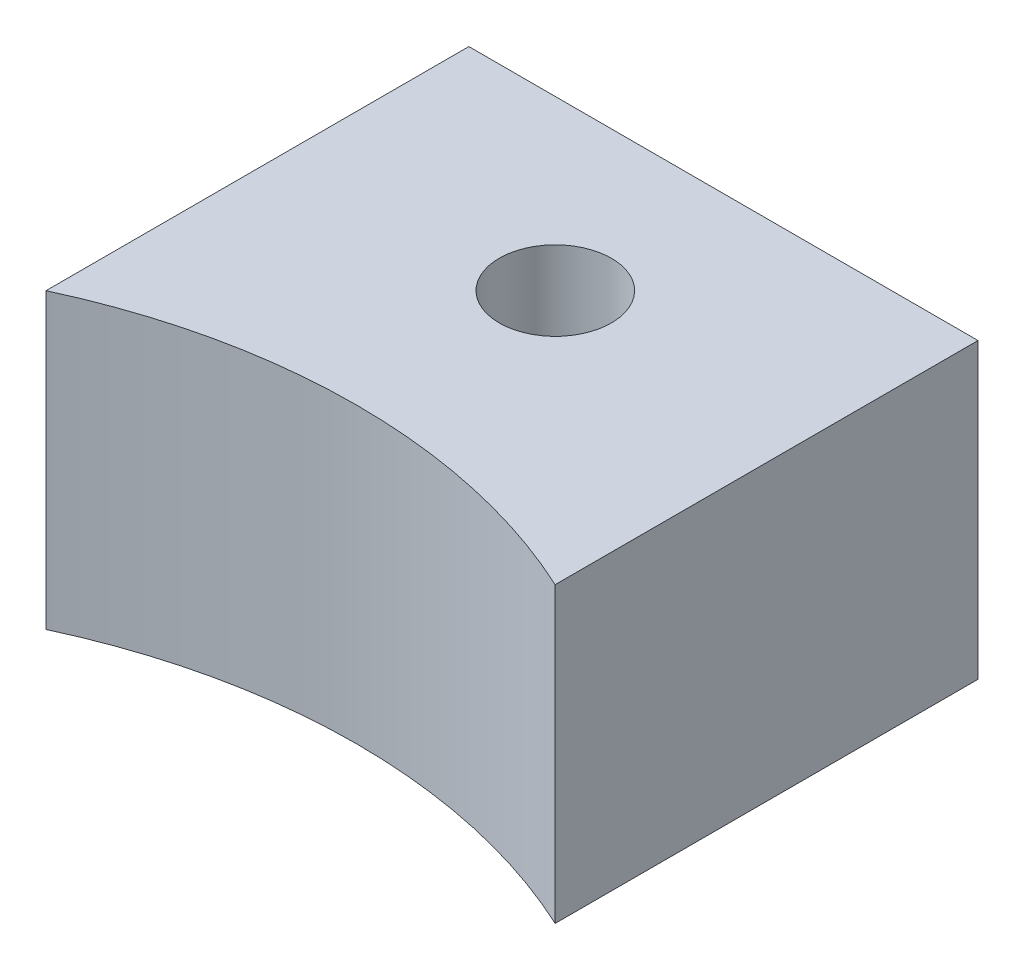
ISO-10303-21;
HEADER;
FILE_DESCRIPTION(('STEP AP214'),'2;1');
FILE_NAME('part.step','',(''),(''),'','','');
FILE_SCHEMA(('AUTOMOTIVE_DESIGN { 1 0 10303 214 1 1 1 1 }'));
ENDSEC;
DATA;
#1=APPLICATION_CONTEXT('core data for automotive mechanical design processes');
#2=APPLICATION_PROTOCOL_DEFINITION('international standard','automotive_design',2000,#1);
#3=PRODUCT_CONTEXT('',#1,'mechanical');
#4=PRODUCT('Part','Part','',(#3));
#5=PRODUCT_RELATED_PRODUCT_CATEGORY('part','',(#4));
#6=PRODUCT_DEFINITION_FORMATION('','',#4);
#7=PRODUCT_DEFINITION_CONTEXT('part definition',#1,'design');
#8=PRODUCT_DEFINITION('design','',#6,#7);
#9=PRODUCT_DEFINITION_SHAPE('','',#8);
#10=(LENGTH_UNIT() NAMED_UNIT(*) SI_UNIT(.MILLI.,.METRE.));
#11=(NAMED_UNIT(*) PLANE_ANGLE_UNIT() SI_UNIT($,.RADIAN.));
#12=(NAMED_UNIT(*) SI_UNIT($,.STERADIAN.) SOLID_ANGLE_UNIT());
#13=UNCERTAINTY_MEASURE_WITH_UNIT(LENGTH_MEASURE(1.E-05),#10,'distance_accuracy_value','');
#14=(GEOMETRIC_REPRESENTATION_CONTEXT(3) GLOBAL_UNCERTAINTY_ASSIGNED_CONTEXT((#13)) GLOBAL_UNIT_ASSIGNED_CONTEXT((#10,
#11,#12)) REPRESENTATION_CONTEXT('',''));
#15=CARTESIAN_POINT('',(0.,0.,0.));
#16=DIRECTION('',(0.,0.,1.));
#17=DIRECTION('',(1.,0.,0.));
#18=AXIS2_PLACEMENT_3D('',#15,#16,#17);
#19=CARTESIAN_POINT('',(0.,17.,56.2401559542483));
#20=DIRECTION('',(0.,-1.,0.));
#21=DIRECTION('',(0.,0.,-1.));
#22=AXIS2_PLACEMENT_3D('',#19,#20,#21);
#23=PLANE('',#22);
#24=DIRECTION('',(0.,0.,1.));
#25=VECTOR('',#24,1.);
#26=CARTESIAN_POINT('',(-14.75,17.,0.));
#27=LINE('',#26,#25);
#28=CARTESIAN_POINT('',(-14.75,17.,0.));
#29=VERTEX_POINT('',#28);
#30=CARTESIAN_POINT('',(-14.75,17.,24.5));
#31=VERTEX_POINT('',#30);
#32=EDGE_CURVE('E85',#29,#31,#27,.T.);
#33=ORIENTED_EDGE('',*,*,#32,.T.);
#34=CARTESIAN_POINT('',(0.,17.,56.2401559542483));
#35=DIRECTION('',(0.,-1.,0.));
#36=DIRECTION('',(0.,0.,-1.));
#37=AXIS2_PLACEMENT_3D('',#34,#35,#36);
#38=CIRCLE('',#37,35.);
#39=CARTESIAN_POINT('',(14.75,17.,24.5));
#40=VERTEX_POINT('',#39);
#41=EDGE_CURVE('E80',#31,#40,#38,.T.);
#42=ORIENTED_EDGE('',*,*,#41,.T.);
#43=DIRECTION('',(0.,0.,-1.));
#44=VECTOR('',#43,1.);
#45=CARTESIAN_POINT('',(14.75,17.,0.));
#46=LINE('',#45,#44);
#47=CARTESIAN_POINT('',(14.75,17.,0.));
#48=VERTEX_POINT('',#47);
#49=EDGE_CURVE('E83',#40,#48,#46,.T.);
#50=ORIENTED_EDGE('',*,*,#49,.T.);
#51=DIRECTION('',(-1.,0.,0.));
#52=VECTOR('',#51,1.);
#53=CARTESIAN_POINT('',(-14.75,17.,0.));
#54=LINE('',#53,#52);
#55=EDGE_CURVE('E50',#48,#29,#54,.T.);
#56=ORIENTED_EDGE('',*,*,#55,.T.);
#57=EDGE_LOOP('',(#33,#42,#50,#56));
#58=FACE_BOUND('',#57,.T.);
#59=CARTESIAN_POINT('',(0.,17.,9.74015595424825));
#60=DIRECTION('',(0.,1.,0.));
#61=DIRECTION('',(0.,0.,1.));
#62=AXIS2_PLACEMENT_3D('',#59,#60,#61);
#63=CIRCLE('',#62,3.25);
#64=CARTESIAN_POINT('',(0.,17.,12.9901559542482));
#65=VERTEX_POINT('',#64);
#66=EDGE_CURVE('E100',#65,#65,#63,.T.);
#67=ORIENTED_EDGE('',*,*,#66,.F.);
#68=EDGE_LOOP('',(#67));
#69=FACE_BOUND('',#68,.T.);
#70=ADVANCED_FACE('F33',(#58,#69),#23,.F.);
#71=CARTESIAN_POINT('',(0.,0.,56.2401559542483));
#72=DIRECTION('',(0.,-1.,0.));
#73=DIRECTION('',(0.,0.,-1.));
#74=AXIS2_PLACEMENT_3D('',#71,#72,#73);
#75=PLANE('',#74);
#76=DIRECTION('',(0.,0.,1.));
#77=VECTOR('',#76,1.);
#78=CARTESIAN_POINT('',(-14.75,0.,0.));
#79=LINE('',#78,#77);
#80=CARTESIAN_POINT('',(-14.75,0.,0.));
#81=VERTEX_POINT('',#80);
#82=CARTESIAN_POINT('',(-14.75,0.,24.5));
#83=VERTEX_POINT('',#82);
#84=EDGE_CURVE('E97',#81,#83,#79,.T.);
#85=ORIENTED_EDGE('',*,*,#84,.F.);
#86=DIRECTION('',(-1.,0.,0.));
#87=VECTOR('',#86,1.);
#88=CARTESIAN_POINT('',(-14.75,0.,0.));
#89=LINE('',#88,#87);
#90=CARTESIAN_POINT('',(14.75,0.,0.));
#91=VERTEX_POINT('',#90);
#92=EDGE_CURVE('E73',#91,#81,#89,.T.);
#93=ORIENTED_EDGE('',*,*,#92,.F.);
#94=DIRECTION('',(0.,0.,-1.));
#95=VECTOR('',#94,1.);
#96=CARTESIAN_POINT('',(14.75,0.,0.));
#97=LINE('',#96,#95);
#98=CARTESIAN_POINT('',(14.75,0.,24.5));
#99=VERTEX_POINT('',#98);
#100=EDGE_CURVE('E67',#99,#91,#97,.T.);
#101=ORIENTED_EDGE('',*,*,#100,.F.);
#102=CARTESIAN_POINT('',(0.,0.,56.2401559542483));
#103=DIRECTION('',(0.,-1.,0.));
#104=DIRECTION('',(0.,0.,-1.));
#105=AXIS2_PLACEMENT_3D('',#102,#103,#104);
#106=CIRCLE('',#105,35.);
#107=EDGE_CURVE('E89',#83,#99,#106,.T.);
#108=ORIENTED_EDGE('',*,*,#107,.F.);
#109=EDGE_LOOP('',(#85,#93,#101,#108));
#110=FACE_BOUND('',#109,.T.);
#111=CARTESIAN_POINT('',(0.,0.,9.74015595424825));
#112=DIRECTION('',(0.,1.,0.));
#113=DIRECTION('',(0.,0.,1.));
#114=AXIS2_PLACEMENT_3D('',#111,#112,#113);
#115=CIRCLE('',#114,3.25);
#116=CARTESIAN_POINT('',(0.,0.,12.9901559542482));
#117=VERTEX_POINT('',#116);
#118=EDGE_CURVE('E112',#117,#117,#115,.T.);
#119=ORIENTED_EDGE('',*,*,#118,.T.);
#120=EDGE_LOOP('',(#119));
#121=FACE_BOUND('',#120,.T.);
#122=ADVANCED_FACE('F108',(#110,#121),#75,.T.);
#123=CARTESIAN_POINT('',(-14.75,17.,0.));
#124=DIRECTION('',(1.,0.,0.));
#125=DIRECTION('',(0.,0.,-1.));
#126=AXIS2_PLACEMENT_3D('',#123,#124,#125);
#127=PLANE('',#126);
#128=ORIENTED_EDGE('',*,*,#84,.T.);
#129=DIRECTION('',(0.,-1.,0.));
#130=VECTOR('',#129,1.);
#131=CARTESIAN_POINT('',(-14.75,17.,24.5));
#132=LINE('',#131,#130);
#133=EDGE_CURVE('E11',#31,#83,#132,.T.);
#134=ORIENTED_EDGE('',*,*,#133,.F.);
#135=ORIENTED_EDGE('',*,*,#32,.F.);
#136=DIRECTION('',(0.,-1.,0.));
#137=VECTOR('',#136,1.);
#138=CARTESIAN_POINT('',(-14.75,17.,0.));
#139=LINE('',#138,#137);
#140=EDGE_CURVE('E93',#29,#81,#139,.T.);
#141=ORIENTED_EDGE('',*,*,#140,.T.);
#142=EDGE_LOOP('',(#128,#134,#135,#141));
#143=FACE_BOUND('',#142,.T.);
#144=ADVANCED_FACE('F35',(#143),#127,.F.);
#145=CARTESIAN_POINT('',(0.,17.,56.2401559542483));
#146=DIRECTION('',(0.,-1.,0.));
#147=DIRECTION('',(0.,0.,-1.));
#148=AXIS2_PLACEMENT_3D('',#145,#146,#147);
#149=CYLINDRICAL_SURFACE('',#148,35.);
#150=ORIENTED_EDGE('',*,*,#107,.T.);
#151=DIRECTION('',(0.,-1.,0.));
#152=VECTOR('',#151,1.);
#153=CARTESIAN_POINT('',(14.75,17.,24.5));
#154=LINE('',#153,#152);
#155=EDGE_CURVE('E42',#40,#99,#154,.T.);
#156=ORIENTED_EDGE('',*,*,#155,.F.);
#157=ORIENTED_EDGE('',*,*,#41,.F.);
#158=ORIENTED_EDGE('',*,*,#133,.T.);
#159=EDGE_LOOP('',(#150,#156,#157,#158));
#160=FACE_BOUND('',#159,.T.);
#161=ADVANCED_FACE('F88',(#160),#149,.F.);
#162=CARTESIAN_POINT('',(14.75,17.,0.));
#163=DIRECTION('',(-1.,0.,0.));
#164=DIRECTION('',(0.,0.,1.));
#165=AXIS2_PLACEMENT_3D('',#162,#163,#164);
#166=PLANE('',#165);
#167=ORIENTED_EDGE('',*,*,#100,.T.);
#168=DIRECTION('',(0.,-1.,0.));
#169=VECTOR('',#168,1.);
#170=CARTESIAN_POINT('',(14.75,17.,0.));
#171=LINE('',#170,#169);
#172=EDGE_CURVE('E90',#48,#91,#171,.T.);
#173=ORIENTED_EDGE('',*,*,#172,.F.);
#174=ORIENTED_EDGE('',*,*,#49,.F.);
#175=ORIENTED_EDGE('',*,*,#155,.T.);
#176=EDGE_LOOP('',(#167,#173,#174,#175));
#177=FACE_BOUND('',#176,.T.);
#178=ADVANCED_FACE('F91',(#177),#166,.F.);
#179=CARTESIAN_POINT('',(-14.75,17.,0.));
#180=DIRECTION('',(0.,0.,1.));
#181=DIRECTION('',(1.,0.,0.));
#182=AXIS2_PLACEMENT_3D('',#179,#180,#181);
#183=PLANE('',#182);
#184=ORIENTED_EDGE('',*,*,#92,.T.);
#185=ORIENTED_EDGE('',*,*,#140,.F.);
#186=ORIENTED_EDGE('',*,*,#55,.F.);
#187=ORIENTED_EDGE('',*,*,#172,.T.);
#188=EDGE_LOOP('',(#184,#185,#186,#187));
#189=FACE_BOUND('',#188,.T.);
#190=ADVANCED_FACE('F105',(#189),#183,.F.);
#191=CARTESIAN_POINT('',(0.,17.,9.74015595424825));
#192=DIRECTION('',(0.,-1.,0.));
#193=DIRECTION('',(0.,0.,-1.));
#194=AXIS2_PLACEMENT_3D('',#191,#192,#193);
#195=CYLINDRICAL_SURFACE('',#194,3.25);
#196=ORIENTED_EDGE('',*,*,#66,.T.);
#197=EDGE_LOOP('',(#196));
#198=FACE_BOUND('',#197,.T.);
#199=ORIENTED_EDGE('',*,*,#118,.F.);
#200=EDGE_LOOP('',(#199));
#201=FACE_BOUND('',#200,.T.);
#202=ADVANCED_FACE('F118',(#198,#201),#195,.F.);
#203=CLOSED_SHELL('',(#70,#122,#144,#161,#178,#190,#202));
#204=MANIFOLD_SOLID_BREP('B2',#203);
#205=ADVANCED_BREP_SHAPE_REPRESENTATION('',(#18,#204),#14);
#206=SHAPE_DEFINITION_REPRESENTATION(#9,#205);
ENDSEC;
END-ISO-10303-21;
